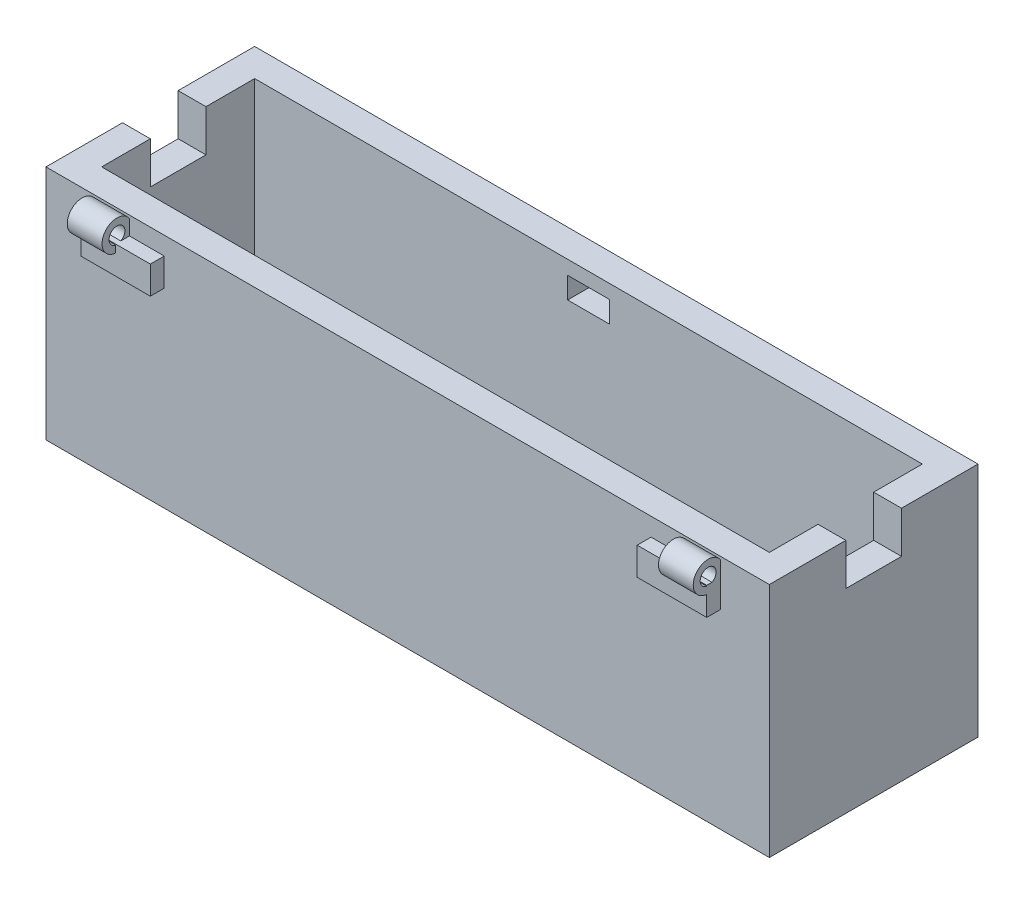
ISO-10303-21;
HEADER;
FILE_DESCRIPTION(('STEP AP214'),'2;1');
FILE_NAME('part.step','',(''),(''),'','','');
FILE_SCHEMA(('AUTOMOTIVE_DESIGN { 1 0 10303 214 1 1 1 1 }'));
ENDSEC;
DATA;
#1=APPLICATION_CONTEXT('core data for automotive mechanical design processes');
#2=APPLICATION_PROTOCOL_DEFINITION('international standard','automotive_design',2000,#1);
#3=PRODUCT_CONTEXT('',#1,'mechanical');
#4=PRODUCT('Part','Part','',(#3));
#5=PRODUCT_RELATED_PRODUCT_CATEGORY('part','',(#4));
#6=PRODUCT_DEFINITION_FORMATION('','',#4);
#7=PRODUCT_DEFINITION_CONTEXT('part definition',#1,'design');
#8=PRODUCT_DEFINITION('design','',#6,#7);
#9=PRODUCT_DEFINITION_SHAPE('','',#8);
#10=(LENGTH_UNIT() NAMED_UNIT(*) SI_UNIT(.MILLI.,.METRE.));
#11=(NAMED_UNIT(*) PLANE_ANGLE_UNIT() SI_UNIT($,.RADIAN.));
#12=(NAMED_UNIT(*) SI_UNIT($,.STERADIAN.) SOLID_ANGLE_UNIT());
#13=UNCERTAINTY_MEASURE_WITH_UNIT(LENGTH_MEASURE(1.E-05),#10,'distance_accuracy_value','');
#14=(GEOMETRIC_REPRESENTATION_CONTEXT(3) GLOBAL_UNCERTAINTY_ASSIGNED_CONTEXT((#13)) GLOBAL_UNIT_ASSIGNED_CONTEXT((#10,
#11,#12)) REPRESENTATION_CONTEXT('',''));
#15=CARTESIAN_POINT('',(0.,0.,0.));
#16=DIRECTION('',(0.,0.,1.));
#17=DIRECTION('',(1.,0.,0.));
#18=AXIS2_PLACEMENT_3D('',#15,#16,#17);
#19=CARTESIAN_POINT('',(-260.,140.,75.));
#20=DIRECTION('',(0.,0.,-1.));
#21=DIRECTION('',(-1.,0.,0.));
#22=AXIS2_PLACEMENT_3D('',#19,#20,#21);
#23=PLANE('',#22);
#24=DIRECTION('',(0.,-1.,0.));
#25=VECTOR('',#24,1.);
#26=CARTESIAN_POINT('',(200.,140.,75.));
#27=LINE('',#26,#25);
#28=CARTESIAN_POINT('',(200.,137.829772243199,75.));
#29=VERTEX_POINT('',#28);
#30=CARTESIAN_POINT('',(200.,127.,75.));
#31=VERTEX_POINT('',#30);
#32=EDGE_CURVE('E324',#29,#31,#27,.T.);
#33=ORIENTED_EDGE('',*,*,#32,.F.);
#34=DIRECTION('',(1.,0.,0.));
#35=VECTOR('',#34,1.);
#36=CARTESIAN_POINT('',(200.,137.829772243199,75.));
#37=LINE('',#36,#35);
#38=CARTESIAN_POINT('',(225.,137.829772243199,75.));
#39=VERTEX_POINT('',#38);
#40=EDGE_CURVE('E326',#29,#39,#37,.T.);
#41=ORIENTED_EDGE('',*,*,#40,.T.);
#42=DIRECTION('',(0.,-1.,0.));
#43=VECTOR('',#42,1.);
#44=CARTESIAN_POINT('',(225.,140.,75.));
#45=LINE('',#44,#43);
#46=CARTESIAN_POINT('',(225.,107.,75.));
#47=VERTEX_POINT('',#46);
#48=EDGE_CURVE('E542',#39,#47,#45,.T.);
#49=ORIENTED_EDGE('',*,*,#48,.T.);
#50=DIRECTION('',(-1.,0.,0.));
#51=VECTOR('',#50,1.);
#52=CARTESIAN_POINT('',(-260.,107.,75.));
#53=LINE('',#52,#51);
#54=CARTESIAN_POINT('',(175.,107.,75.));
#55=VERTEX_POINT('',#54);
#56=EDGE_CURVE('E539',#47,#55,#53,.T.);
#57=ORIENTED_EDGE('',*,*,#56,.T.);
#58=DIRECTION('',(0.,1.,0.));
#59=VECTOR('',#58,1.);
#60=CARTESIAN_POINT('',(175.,140.000000000001,75.));
#61=LINE('',#60,#59);
#62=CARTESIAN_POINT('',(175.,127.,75.));
#63=VERTEX_POINT('',#62);
#64=EDGE_CURVE('E547',#55,#63,#61,.T.);
#65=ORIENTED_EDGE('',*,*,#64,.T.);
#66=DIRECTION('',(1.,0.,0.));
#67=VECTOR('',#66,1.);
#68=CARTESIAN_POINT('',(-260.,127.,75.));
#69=LINE('',#68,#67);
#70=EDGE_CURVE('E544',#63,#31,#69,.T.);
#71=ORIENTED_EDGE('',*,*,#70,.T.);
#72=EDGE_LOOP('',(#33,#41,#49,#57,#65,#71));
#73=FACE_BOUND('',#72,.T.);
#74=DIRECTION('',(0.,-1.,0.));
#75=VECTOR('',#74,1.);
#76=CARTESIAN_POINT('',(-260.,140.,75.));
#77=LINE('',#76,#75);
#78=CARTESIAN_POINT('',(-260.,140.,75.));
#79=VERTEX_POINT('',#78);
#80=CARTESIAN_POINT('',(-260.,-30.,75.));
#81=VERTEX_POINT('',#80);
#82=EDGE_CURVE('E495',#79,#81,#77,.T.);
#83=ORIENTED_EDGE('',*,*,#82,.T.);
#84=DIRECTION('',(-1.,0.,0.));
#85=VECTOR('',#84,1.);
#86=CARTESIAN_POINT('',(-260.,-30.,75.));
#87=LINE('',#86,#85);
#88=CARTESIAN_POINT('',(260.,-30.,75.));
#89=VERTEX_POINT('',#88);
#90=EDGE_CURVE('E399',#89,#81,#87,.T.);
#91=ORIENTED_EDGE('',*,*,#90,.F.);
#92=DIRECTION('',(0.,-1.,0.));
#93=VECTOR('',#92,1.);
#94=CARTESIAN_POINT('',(260.,140.,75.));
#95=LINE('',#94,#93);
#96=CARTESIAN_POINT('',(260.,140.,75.));
#97=VERTEX_POINT('',#96);
#98=EDGE_CURVE('E493',#97,#89,#95,.T.);
#99=ORIENTED_EDGE('',*,*,#98,.F.);
#100=DIRECTION('',(1.,0.,0.));
#101=VECTOR('',#100,1.);
#102=CARTESIAN_POINT('',(-260.,140.,75.));
#103=LINE('',#102,#101);
#104=EDGE_CURVE('E491',#79,#97,#103,.T.);
#105=ORIENTED_EDGE('',*,*,#104,.F.);
#106=EDGE_LOOP('',(#83,#91,#99,#105));
#107=FACE_BOUND('',#106,.T.);
#108=DIRECTION('',(0.,1.,0.));
#109=VECTOR('',#108,1.);
#110=CARTESIAN_POINT('',(-200.,140.,75.));
#111=LINE('',#110,#109);
#112=CARTESIAN_POINT('',(-200.,127.,75.));
#113=VERTEX_POINT('',#112);
#114=CARTESIAN_POINT('',(-200.,137.829772243199,75.));
#115=VERTEX_POINT('',#114);
#116=EDGE_CURVE('E299',#113,#115,#111,.T.);
#117=ORIENTED_EDGE('',*,*,#116,.F.);
#118=DIRECTION('',(1.,0.,0.));
#119=VECTOR('',#118,1.);
#120=CARTESIAN_POINT('',(-260.,127.,75.));
#121=LINE('',#120,#119);
#122=CARTESIAN_POINT('',(-175.,127.,75.));
#123=VERTEX_POINT('',#122);
#124=EDGE_CURVE('E298',#113,#123,#121,.T.);
#125=ORIENTED_EDGE('',*,*,#124,.T.);
#126=DIRECTION('',(0.,-1.,0.));
#127=VECTOR('',#126,1.);
#128=CARTESIAN_POINT('',(-175.,140.,75.));
#129=LINE('',#128,#127);
#130=CARTESIAN_POINT('',(-175.,107.,75.));
#131=VERTEX_POINT('',#130);
#132=EDGE_CURVE('E533',#123,#131,#129,.T.);
#133=ORIENTED_EDGE('',*,*,#132,.T.);
#134=DIRECTION('',(-1.,0.,0.));
#135=VECTOR('',#134,1.);
#136=CARTESIAN_POINT('',(-260.,107.,75.));
#137=LINE('',#136,#135);
#138=CARTESIAN_POINT('',(-225.,107.,75.));
#139=VERTEX_POINT('',#138);
#140=EDGE_CURVE('E530',#131,#139,#137,.T.);
#141=ORIENTED_EDGE('',*,*,#140,.T.);
#142=DIRECTION('',(0.,1.,0.));
#143=VECTOR('',#142,1.);
#144=CARTESIAN_POINT('',(-225.,140.,75.));
#145=LINE('',#144,#143);
#146=CARTESIAN_POINT('',(-225.,137.829772243199,75.));
#147=VERTEX_POINT('',#146);
#148=EDGE_CURVE('E537',#139,#147,#145,.T.);
#149=ORIENTED_EDGE('',*,*,#148,.T.);
#150=DIRECTION('',(-1.,0.,0.));
#151=VECTOR('',#150,1.);
#152=CARTESIAN_POINT('',(-200.,137.829772243199,75.));
#153=LINE('',#152,#151);
#154=EDGE_CURVE('E301',#147,#115,#153,.F.);
#155=ORIENTED_EDGE('',*,*,#154,.T.);
#156=EDGE_LOOP('',(#117,#125,#133,#141,#149,#155));
#157=FACE_BOUND('',#156,.T.);
#158=ADVANCED_FACE('F45',(#73,#107,#157),#23,.F.);
#159=CARTESIAN_POINT('',(-225.,127.,65.));
#160=DIRECTION('',(0.,1.,0.));
#161=DIRECTION('',(0.,0.,1.));
#162=AXIS2_PLACEMENT_3D('',#159,#160,#161);
#163=PLANE('',#162);
#164=ORIENTED_EDGE('',*,*,#124,.F.);
#165=DIRECTION('',(0.,0.,1.));
#166=VECTOR('',#165,1.);
#167=CARTESIAN_POINT('',(-200.,127.,65.));
#168=LINE('',#167,#166);
#169=CARTESIAN_POINT('',(-200.,127.,81.2152908177372));
#170=VERTEX_POINT('',#169);
#171=EDGE_CURVE('E284',#113,#170,#168,.T.);
#172=ORIENTED_EDGE('',*,*,#171,.T.);
#173=DIRECTION('',(-1.,0.,0.));
#174=VECTOR('',#173,1.);
#175=CARTESIAN_POINT('',(-200.,127.,81.2152908177372));
#176=LINE('',#175,#174);
#177=CARTESIAN_POINT('',(-225.,127.,81.2152908177372));
#178=VERTEX_POINT('',#177);
#179=EDGE_CURVE('E279',#170,#178,#176,.T.);
#180=ORIENTED_EDGE('',*,*,#179,.T.);
#181=DIRECTION('',(0.,0.,1.));
#182=VECTOR('',#181,1.);
#183=CARTESIAN_POINT('',(-225.,127.,65.));
#184=LINE('',#183,#182);
#185=CARTESIAN_POINT('',(-225.,127.,85.));
#186=VERTEX_POINT('',#185);
#187=EDGE_CURVE('E364',#178,#186,#184,.T.);
#188=ORIENTED_EDGE('',*,*,#187,.T.);
#189=DIRECTION('',(-1.,0.,0.));
#190=VECTOR('',#189,1.);
#191=CARTESIAN_POINT('',(-225.,127.,85.));
#192=LINE('',#191,#190);
#193=CARTESIAN_POINT('',(-175.,127.,85.));
#194=VERTEX_POINT('',#193);
#195=EDGE_CURVE('E360',#194,#186,#192,.T.);
#196=ORIENTED_EDGE('',*,*,#195,.F.);
#197=DIRECTION('',(0.,0.,1.));
#198=VECTOR('',#197,1.);
#199=CARTESIAN_POINT('',(-175.,127.,65.));
#200=LINE('',#199,#198);
#201=EDGE_CURVE('E367',#123,#194,#200,.T.);
#202=ORIENTED_EDGE('',*,*,#201,.F.);
#203=EDGE_LOOP('',(#164,#172,#180,#188,#196,#202));
#204=FACE_BOUND('',#203,.T.);
#205=ADVANCED_FACE('F296',(#204),#163,.T.);
#206=CARTESIAN_POINT('',(175.,127.,65.));
#207=DIRECTION('',(0.,1.,0.));
#208=DIRECTION('',(0.,0.,1.));
#209=AXIS2_PLACEMENT_3D('',#206,#207,#208);
#210=PLANE('',#209);
#211=DIRECTION('',(1.,0.,0.));
#212=VECTOR('',#211,1.);
#213=CARTESIAN_POINT('',(200.,127.,81.2152908177372));
#214=LINE('',#213,#212);
#215=CARTESIAN_POINT('',(225.,127.,81.2152908177372));
#216=VERTEX_POINT('',#215);
#217=CARTESIAN_POINT('',(200.,127.,81.2152908177372));
#218=VERTEX_POINT('',#217);
#219=EDGE_CURVE('E316',#216,#218,#214,.F.);
#220=ORIENTED_EDGE('',*,*,#219,.T.);
#221=DIRECTION('',(0.,0.,-1.));
#222=VECTOR('',#221,1.);
#223=CARTESIAN_POINT('',(200.,127.,65.));
#224=LINE('',#223,#222);
#225=EDGE_CURVE('E321',#218,#31,#224,.T.);
#226=ORIENTED_EDGE('',*,*,#225,.T.);
#227=ORIENTED_EDGE('',*,*,#70,.F.);
#228=DIRECTION('',(0.,0.,1.));
#229=VECTOR('',#228,1.);
#230=CARTESIAN_POINT('',(175.,127.,65.));
#231=LINE('',#230,#229);
#232=CARTESIAN_POINT('',(175.,127.,85.));
#233=VERTEX_POINT('',#232);
#234=EDGE_CURVE('E343',#63,#233,#231,.T.);
#235=ORIENTED_EDGE('',*,*,#234,.T.);
#236=DIRECTION('',(-1.,0.,0.));
#237=VECTOR('',#236,1.);
#238=CARTESIAN_POINT('',(175.,127.,85.));
#239=LINE('',#238,#237);
#240=CARTESIAN_POINT('',(225.,127.,85.));
#241=VERTEX_POINT('',#240);
#242=EDGE_CURVE('E339',#241,#233,#239,.T.);
#243=ORIENTED_EDGE('',*,*,#242,.F.);
#244=DIRECTION('',(0.,0.,1.));
#245=VECTOR('',#244,1.);
#246=CARTESIAN_POINT('',(225.,127.,65.));
#247=LINE('',#246,#245);
#248=EDGE_CURVE('E346',#216,#241,#247,.T.);
#249=ORIENTED_EDGE('',*,*,#248,.F.);
#250=EDGE_LOOP('',(#220,#226,#227,#235,#243,#249));
#251=FACE_BOUND('',#250,.T.);
#252=ADVANCED_FACE('F600',(#251),#210,.T.);
#253=CARTESIAN_POINT('',(0.,140.,0.));
#254=DIRECTION('',(0.,1.,0.));
#255=DIRECTION('',(0.,0.,1.));
#256=AXIS2_PLACEMENT_3D('',#253,#254,#255);
#257=PLANE('',#256);
#258=DIRECTION('',(-1.,0.,0.));
#259=VECTOR('',#258,1.);
#260=CARTESIAN_POINT('',(260.,140.,-20.0000000000002));
#261=LINE('',#260,#259);
#262=CARTESIAN_POINT('',(260.,140.,-20.0000000000002));
#263=VERTEX_POINT('',#262);
#264=CARTESIAN_POINT('',(240.,140.,-20.0000000000002));
#265=VERTEX_POINT('',#264);
#266=EDGE_CURVE('E420',#263,#265,#261,.T.);
#267=ORIENTED_EDGE('',*,*,#266,.F.);
#268=DIRECTION('',(0.,0.,-1.));
#269=VECTOR('',#268,1.);
#270=CARTESIAN_POINT('',(260.,140.,-75.));
#271=LINE('',#270,#269);
#272=CARTESIAN_POINT('',(260.,140.,-75.));
#273=VERTEX_POINT('',#272);
#274=EDGE_CURVE('E471',#263,#273,#271,.T.);
#275=ORIENTED_EDGE('',*,*,#274,.T.);
#276=DIRECTION('',(-1.,0.,0.));
#277=VECTOR('',#276,1.);
#278=CARTESIAN_POINT('',(-260.,140.,-75.));
#279=LINE('',#278,#277);
#280=CARTESIAN_POINT('',(15.,140.,-75.));
#281=VERTEX_POINT('',#280);
#282=EDGE_CURVE('E483',#273,#281,#279,.T.);
#283=ORIENTED_EDGE('',*,*,#282,.T.);
#284=CARTESIAN_POINT('',(-15.0000000000001,140.,-75.));
#285=VERTEX_POINT('',#284);
#286=EDGE_CURVE('E487',#281,#285,#279,.T.);
#287=ORIENTED_EDGE('',*,*,#286,.T.);
#288=CARTESIAN_POINT('',(-260.,140.,-75.));
#289=VERTEX_POINT('',#288);
#290=EDGE_CURVE('E482',#285,#289,#279,.T.);
#291=ORIENTED_EDGE('',*,*,#290,.T.);
#292=DIRECTION('',(0.,0.,1.));
#293=VECTOR('',#292,1.);
#294=CARTESIAN_POINT('',(-260.,140.,-75.));
#295=LINE('',#294,#293);
#296=CARTESIAN_POINT('',(-260.,140.,-20.));
#297=VERTEX_POINT('',#296);
#298=EDGE_CURVE('E488',#289,#297,#295,.T.);
#299=ORIENTED_EDGE('',*,*,#298,.T.);
#300=CARTESIAN_POINT('',(-240.,140.,-20.));
#301=VERTEX_POINT('',#300);
#302=EDGE_CURVE('E423',#301,#297,#261,.T.);
#303=ORIENTED_EDGE('',*,*,#302,.F.);
#304=DIRECTION('',(0.,0.,1.));
#305=VECTOR('',#304,1.);
#306=CARTESIAN_POINT('',(-240.,140.,-55.));
#307=LINE('',#306,#305);
#308=CARTESIAN_POINT('',(-240.,140.,-55.));
#309=VERTEX_POINT('',#308);
#310=EDGE_CURVE('E464',#309,#301,#307,.T.);
#311=ORIENTED_EDGE('',*,*,#310,.F.);
#312=DIRECTION('',(-1.,0.,0.));
#313=VECTOR('',#312,1.);
#314=CARTESIAN_POINT('',(-240.,140.,-55.));
#315=LINE('',#314,#313);
#316=CARTESIAN_POINT('',(240.,140.,-55.));
#317=VERTEX_POINT('',#316);
#318=EDGE_CURVE('E460',#317,#309,#315,.T.);
#319=ORIENTED_EDGE('',*,*,#318,.F.);
#320=DIRECTION('',(0.,0.,-1.));
#321=VECTOR('',#320,1.);
#322=CARTESIAN_POINT('',(240.,140.,-55.));
#323=LINE('',#322,#321);
#324=EDGE_CURVE('E442',#265,#317,#323,.T.);
#325=ORIENTED_EDGE('',*,*,#324,.F.);
#326=EDGE_LOOP('',(#267,#275,#283,#287,#291,#299,#303,#311,#319,#325));
#327=FACE_BOUND('',#326,.T.);
#328=ADVANCED_FACE('F616',(#327),#257,.T.);
#329=CARTESIAN_POINT('',(260.,140.,-75.));
#330=DIRECTION('',(-1.,0.,0.));
#331=DIRECTION('',(0.,0.,1.));
#332=AXIS2_PLACEMENT_3D('',#329,#330,#331);
#333=PLANE('',#332);
#334=ORIENTED_EDGE('',*,*,#274,.F.);
#335=DIRECTION('',(0.,-1.,0.));
#336=VECTOR('',#335,1.);
#337=CARTESIAN_POINT('',(260.,140.,-20.0000000000002));
#338=LINE('',#337,#336);
#339=CARTESIAN_POINT('',(260.,110.,-20.0000000000002));
#340=VERTEX_POINT('',#339);
#341=EDGE_CURVE('E403',#263,#340,#338,.T.);
#342=ORIENTED_EDGE('',*,*,#341,.T.);
#343=DIRECTION('',(0.,0.,1.));
#344=VECTOR('',#343,1.);
#345=CARTESIAN_POINT('',(260.,110.,-20.0000000000002));
#346=LINE('',#345,#344);
#347=CARTESIAN_POINT('',(260.,110.,19.9999999999998));
#348=VERTEX_POINT('',#347);
#349=EDGE_CURVE('E406',#340,#348,#346,.T.);
#350=ORIENTED_EDGE('',*,*,#349,.T.);
#351=DIRECTION('',(0.,1.,0.));
#352=VECTOR('',#351,1.);
#353=CARTESIAN_POINT('',(260.,140.,19.9999999999998));
#354=LINE('',#353,#352);
#355=CARTESIAN_POINT('',(260.,140.,19.9999999999998));
#356=VERTEX_POINT('',#355);
#357=EDGE_CURVE('E410',#348,#356,#354,.T.);
#358=ORIENTED_EDGE('',*,*,#357,.T.);
#359=EDGE_CURVE('E479',#97,#356,#271,.T.);
#360=ORIENTED_EDGE('',*,*,#359,.F.);
#361=ORIENTED_EDGE('',*,*,#98,.T.);
#362=DIRECTION('',(0.,0.,1.));
#363=VECTOR('',#362,1.);
#364=CARTESIAN_POINT('',(260.,-30.,-75.));
#365=LINE('',#364,#363);
#366=CARTESIAN_POINT('',(260.,-30.,-75.));
#367=VERTEX_POINT('',#366);
#368=EDGE_CURVE('E396',#367,#89,#365,.T.);
#369=ORIENTED_EDGE('',*,*,#368,.F.);
#370=DIRECTION('',(0.,-1.,0.));
#371=VECTOR('',#370,1.);
#372=CARTESIAN_POINT('',(260.,140.,-75.));
#373=LINE('',#372,#371);
#374=EDGE_CURVE('E499',#273,#367,#373,.T.);
#375=ORIENTED_EDGE('',*,*,#374,.F.);
#376=EDGE_LOOP('',(#334,#342,#350,#358,#360,#361,#369,#375));
#377=FACE_BOUND('',#376,.T.);
#378=ADVANCED_FACE('F613',(#377),#333,.F.);
#379=CARTESIAN_POINT('',(-260.,140.,-75.));
#380=DIRECTION('',(0.,0.,1.));
#381=DIRECTION('',(1.,0.,0.));
#382=AXIS2_PLACEMENT_3D('',#379,#380,#381);
#383=PLANE('',#382);
#384=DIRECTION('',(0.,-1.,0.));
#385=VECTOR('',#384,1.);
#386=CARTESIAN_POINT('',(15.,130.,-75.));
#387=LINE('',#386,#385);
#388=CARTESIAN_POINT('',(15.,114.647041027345,-75.));
#389=VERTEX_POINT('',#388);
#390=EDGE_CURVE('E374',#281,#389,#387,.T.);
#391=ORIENTED_EDGE('',*,*,#390,.F.);
#392=ORIENTED_EDGE('',*,*,#282,.F.);
#393=ORIENTED_EDGE('',*,*,#374,.T.);
#394=DIRECTION('',(1.,0.,0.));
#395=VECTOR('',#394,1.);
#396=CARTESIAN_POINT('',(-260.,-30.,-75.));
#397=LINE('',#396,#395);
#398=CARTESIAN_POINT('',(-260.,-30.,-75.));
#399=VERTEX_POINT('',#398);
#400=EDGE_CURVE('E393',#399,#367,#397,.T.);
#401=ORIENTED_EDGE('',*,*,#400,.F.);
#402=DIRECTION('',(0.,-1.,0.));
#403=VECTOR('',#402,1.);
#404=CARTESIAN_POINT('',(-260.,140.,-75.));
#405=LINE('',#404,#403);
#406=EDGE_CURVE('E497',#289,#399,#405,.T.);
#407=ORIENTED_EDGE('',*,*,#406,.F.);
#408=ORIENTED_EDGE('',*,*,#290,.F.);
#409=DIRECTION('',(0.,1.,0.));
#410=VECTOR('',#409,1.);
#411=CARTESIAN_POINT('',(-15.0000000000001,130.,-75.));
#412=LINE('',#411,#410);
#413=CARTESIAN_POINT('',(-15.0000000000001,114.647041027345,-75.));
#414=VERTEX_POINT('',#413);
#415=EDGE_CURVE('E366',#414,#285,#412,.T.);
#416=ORIENTED_EDGE('',*,*,#415,.F.);
#417=DIRECTION('',(-1.,0.,0.));
#418=VECTOR('',#417,1.);
#419=CARTESIAN_POINT('',(15.,114.647041027345,-75.));
#420=LINE('',#419,#418);
#421=EDGE_CURVE('E377',#389,#414,#420,.T.);
#422=ORIENTED_EDGE('',*,*,#421,.F.);
#423=EDGE_LOOP('',(#391,#392,#393,#401,#407,#408,#416,#422));
#424=FACE_BOUND('',#423,.T.);
#425=ADVANCED_FACE('F610',(#424),#383,.F.);
#426=CARTESIAN_POINT('',(-260.,140.,-75.));
#427=DIRECTION('',(1.,0.,0.));
#428=DIRECTION('',(0.,0.,-1.));
#429=AXIS2_PLACEMENT_3D('',#426,#427,#428);
#430=PLANE('',#429);
#431=DIRECTION('',(0.,0.,1.));
#432=VECTOR('',#431,1.);
#433=CARTESIAN_POINT('',(-260.,110.,-20.));
#434=LINE('',#433,#432);
#435=CARTESIAN_POINT('',(-260.,110.,-20.));
#436=VERTEX_POINT('',#435);
#437=CARTESIAN_POINT('',(-260.,110.,20.));
#438=VERTEX_POINT('',#437);
#439=EDGE_CURVE('E416',#436,#438,#434,.T.);
#440=ORIENTED_EDGE('',*,*,#439,.F.);
#441=DIRECTION('',(0.,-1.,0.));
#442=VECTOR('',#441,1.);
#443=CARTESIAN_POINT('',(-260.,140.,-20.));
#444=LINE('',#443,#442);
#445=EDGE_CURVE('E402',#297,#436,#444,.T.);
#446=ORIENTED_EDGE('',*,*,#445,.F.);
#447=ORIENTED_EDGE('',*,*,#298,.F.);
#448=ORIENTED_EDGE('',*,*,#406,.T.);
#449=DIRECTION('',(0.,0.,-1.));
#450=VECTOR('',#449,1.);
#451=CARTESIAN_POINT('',(-260.,-30.,-75.));
#452=LINE('',#451,#450);
#453=EDGE_CURVE('E383',#81,#399,#452,.T.);
#454=ORIENTED_EDGE('',*,*,#453,.F.);
#455=ORIENTED_EDGE('',*,*,#82,.F.);
#456=CARTESIAN_POINT('',(-260.,140.,20.));
#457=VERTEX_POINT('',#456);
#458=EDGE_CURVE('E486',#457,#79,#295,.T.);
#459=ORIENTED_EDGE('',*,*,#458,.F.);
#460=DIRECTION('',(0.,1.,0.));
#461=VECTOR('',#460,1.);
#462=CARTESIAN_POINT('',(-260.,140.,20.));
#463=LINE('',#462,#461);
#464=EDGE_CURVE('E407',#438,#457,#463,.T.);
#465=ORIENTED_EDGE('',*,*,#464,.F.);
#466=EDGE_LOOP('',(#440,#446,#447,#448,#454,#455,#459,#465));
#467=FACE_BOUND('',#466,.T.);
#468=ADVANCED_FACE('F607',(#467),#430,.F.);
#469=DIRECTION('',(-1.,0.,0.));
#470=VECTOR('',#469,1.);
#471=CARTESIAN_POINT('',(260.,140.,19.9999999999998));
#472=LINE('',#471,#470);
#473=CARTESIAN_POINT('',(-240.,140.,20.));
#474=VERTEX_POINT('',#473);
#475=EDGE_CURVE('E427',#474,#457,#472,.T.);
#476=ORIENTED_EDGE('',*,*,#475,.T.);
#477=ORIENTED_EDGE('',*,*,#458,.T.);
#478=ORIENTED_EDGE('',*,*,#104,.T.);
#479=ORIENTED_EDGE('',*,*,#359,.T.);
#480=CARTESIAN_POINT('',(240.,140.,19.9999999999998));
#481=VERTEX_POINT('',#480);
#482=EDGE_CURVE('E424',#356,#481,#472,.T.);
#483=ORIENTED_EDGE('',*,*,#482,.T.);
#484=CARTESIAN_POINT('',(240.,140.,55.));
#485=VERTEX_POINT('',#484);
#486=EDGE_CURVE('E457',#485,#481,#323,.T.);
#487=ORIENTED_EDGE('',*,*,#486,.F.);
#488=DIRECTION('',(1.,0.,0.));
#489=VECTOR('',#488,1.);
#490=CARTESIAN_POINT('',(-240.,140.,55.));
#491=LINE('',#490,#489);
#492=CARTESIAN_POINT('',(-240.,140.,55.));
#493=VERTEX_POINT('',#492);
#494=EDGE_CURVE('E447',#493,#485,#491,.T.);
#495=ORIENTED_EDGE('',*,*,#494,.F.);
#496=EDGE_CURVE('E463',#474,#493,#307,.T.);
#497=ORIENTED_EDGE('',*,*,#496,.F.);
#498=EDGE_LOOP('',(#476,#477,#478,#479,#483,#487,#495,#497));
#499=FACE_BOUND('',#498,.T.);
#500=ADVANCED_FACE('F605',(#499),#257,.T.);
#501=CARTESIAN_POINT('',(240.,20.,-55.));
#502=DIRECTION('',(1.,0.,0.));
#503=DIRECTION('',(0.,0.,-1.));
#504=AXIS2_PLACEMENT_3D('',#501,#502,#503);
#505=PLANE('',#504);
#506=DIRECTION('',(0.,0.,-1.));
#507=VECTOR('',#506,1.);
#508=CARTESIAN_POINT('',(240.,110.,-55.));
#509=LINE('',#508,#507);
#510=CARTESIAN_POINT('',(240.,110.,19.9999999999998));
#511=VERTEX_POINT('',#510);
#512=CARTESIAN_POINT('',(240.,110.,-20.0000000000002));
#513=VERTEX_POINT('',#512);
#514=EDGE_CURVE('E422',#511,#513,#509,.T.);
#515=ORIENTED_EDGE('',*,*,#514,.T.);
#516=DIRECTION('',(0.,1.,0.));
#517=VECTOR('',#516,1.);
#518=CARTESIAN_POINT('',(240.,20.,-20.0000000000002));
#519=LINE('',#518,#517);
#520=EDGE_CURVE('E439',#513,#265,#519,.T.);
#521=ORIENTED_EDGE('',*,*,#520,.T.);
#522=ORIENTED_EDGE('',*,*,#324,.T.);
#523=DIRECTION('',(0.,1.,0.));
#524=VECTOR('',#523,1.);
#525=CARTESIAN_POINT('',(240.,20.,-55.));
#526=LINE('',#525,#524);
#527=CARTESIAN_POINT('',(240.,20.,-55.));
#528=VERTEX_POINT('',#527);
#529=EDGE_CURVE('E456',#528,#317,#526,.T.);
#530=ORIENTED_EDGE('',*,*,#529,.F.);
#531=DIRECTION('',(0.,0.,-1.));
#532=VECTOR('',#531,1.);
#533=CARTESIAN_POINT('',(240.,20.,-55.));
#534=LINE('',#533,#532);
#535=CARTESIAN_POINT('',(240.,20.,55.));
#536=VERTEX_POINT('',#535);
#537=EDGE_CURVE('E443',#536,#528,#534,.T.);
#538=ORIENTED_EDGE('',*,*,#537,.F.);
#539=DIRECTION('',(0.,1.,0.));
#540=VECTOR('',#539,1.);
#541=CARTESIAN_POINT('',(240.,20.,55.));
#542=LINE('',#541,#540);
#543=EDGE_CURVE('E469',#536,#485,#542,.T.);
#544=ORIENTED_EDGE('',*,*,#543,.T.);
#545=ORIENTED_EDGE('',*,*,#486,.T.);
#546=DIRECTION('',(0.,-1.,0.));
#547=VECTOR('',#546,1.);
#548=CARTESIAN_POINT('',(240.,20.,19.9999999999998));
#549=LINE('',#548,#547);
#550=EDGE_CURVE('E436',#481,#511,#549,.T.);
#551=ORIENTED_EDGE('',*,*,#550,.T.);
#552=EDGE_LOOP('',(#515,#521,#522,#530,#538,#544,#545,#551));
#553=FACE_BOUND('',#552,.T.);
#554=ADVANCED_FACE('F670',(#553),#505,.F.);
#555=CARTESIAN_POINT('',(-240.,20.,55.));
#556=DIRECTION('',(0.,0.,1.));
#557=DIRECTION('',(1.,0.,0.));
#558=AXIS2_PLACEMENT_3D('',#555,#556,#557);
#559=PLANE('',#558);
#560=ORIENTED_EDGE('',*,*,#494,.T.);
#561=ORIENTED_EDGE('',*,*,#543,.F.);
#562=DIRECTION('',(1.,0.,0.));
#563=VECTOR('',#562,1.);
#564=CARTESIAN_POINT('',(-240.,20.,55.));
#565=LINE('',#564,#563);
#566=CARTESIAN_POINT('',(-240.,20.,55.));
#567=VERTEX_POINT('',#566);
#568=EDGE_CURVE('E453',#567,#536,#565,.T.);
#569=ORIENTED_EDGE('',*,*,#568,.F.);
#570=DIRECTION('',(0.,1.,0.));
#571=VECTOR('',#570,1.);
#572=CARTESIAN_POINT('',(-240.,20.,55.));
#573=LINE('',#572,#571);
#574=EDGE_CURVE('E472',#567,#493,#573,.T.);
#575=ORIENTED_EDGE('',*,*,#574,.T.);
#576=EDGE_LOOP('',(#560,#561,#569,#575));
#577=FACE_BOUND('',#576,.T.);
#578=ADVANCED_FACE('F697',(#577),#559,.F.);
#579=CARTESIAN_POINT('',(-240.,20.,-55.));
#580=DIRECTION('',(-1.,0.,0.));
#581=DIRECTION('',(0.,0.,1.));
#582=AXIS2_PLACEMENT_3D('',#579,#580,#581);
#583=PLANE('',#582);
#584=ORIENTED_EDGE('',*,*,#310,.T.);
#585=DIRECTION('',(0.,-1.,0.));
#586=VECTOR('',#585,1.);
#587=CARTESIAN_POINT('',(-240.,20.,-20.));
#588=LINE('',#587,#586);
#589=CARTESIAN_POINT('',(-240.,110.,-20.));
#590=VERTEX_POINT('',#589);
#591=EDGE_CURVE('E507',#301,#590,#588,.T.);
#592=ORIENTED_EDGE('',*,*,#591,.T.);
#593=DIRECTION('',(0.,0.,1.));
#594=VECTOR('',#593,1.);
#595=CARTESIAN_POINT('',(-240.,110.,-55.));
#596=LINE('',#595,#594);
#597=CARTESIAN_POINT('',(-240.,110.,20.));
#598=VERTEX_POINT('',#597);
#599=EDGE_CURVE('E501',#590,#598,#596,.T.);
#600=ORIENTED_EDGE('',*,*,#599,.T.);
#601=DIRECTION('',(0.,1.,0.));
#602=VECTOR('',#601,1.);
#603=CARTESIAN_POINT('',(-240.,20.,20.));
#604=LINE('',#603,#602);
#605=EDGE_CURVE('E504',#598,#474,#604,.T.);
#606=ORIENTED_EDGE('',*,*,#605,.T.);
#607=ORIENTED_EDGE('',*,*,#496,.T.);
#608=ORIENTED_EDGE('',*,*,#574,.F.);
#609=DIRECTION('',(0.,0.,1.));
#610=VECTOR('',#609,1.);
#611=CARTESIAN_POINT('',(-240.,20.,-55.));
#612=LINE('',#611,#610);
#613=CARTESIAN_POINT('',(-240.,20.,-55.));
#614=VERTEX_POINT('',#613);
#615=EDGE_CURVE('E450',#614,#567,#612,.T.);
#616=ORIENTED_EDGE('',*,*,#615,.F.);
#617=DIRECTION('',(0.,1.,0.));
#618=VECTOR('',#617,1.);
#619=CARTESIAN_POINT('',(-240.,20.,-55.));
#620=LINE('',#619,#618);
#621=EDGE_CURVE('E475',#614,#309,#620,.T.);
#622=ORIENTED_EDGE('',*,*,#621,.T.);
#623=EDGE_LOOP('',(#584,#592,#600,#606,#607,#608,#616,#622));
#624=FACE_BOUND('',#623,.T.);
#625=ADVANCED_FACE('F664',(#624),#583,.F.);
#626=CARTESIAN_POINT('',(-240.,20.,-55.));
#627=DIRECTION('',(0.,0.,-1.));
#628=DIRECTION('',(-1.,0.,0.));
#629=AXIS2_PLACEMENT_3D('',#626,#627,#628);
#630=PLANE('',#629);
#631=DIRECTION('',(-1.,0.,0.));
#632=VECTOR('',#631,1.);
#633=CARTESIAN_POINT('',(-240.,114.647041027345,-55.));
#634=LINE('',#633,#632);
#635=CARTESIAN_POINT('',(15.,114.647041027345,-55.));
#636=VERTEX_POINT('',#635);
#637=CARTESIAN_POINT('',(-15.0000000000001,114.647041027345,-55.));
#638=VERTEX_POINT('',#637);
#639=EDGE_CURVE('E516',#636,#638,#634,.T.);
#640=ORIENTED_EDGE('',*,*,#639,.T.);
#641=DIRECTION('',(0.,1.,0.));
#642=VECTOR('',#641,1.);
#643=CARTESIAN_POINT('',(-15.0000000000001,20.,-55.));
#644=LINE('',#643,#642);
#645=CARTESIAN_POINT('',(-15.0000000000001,130.,-55.));
#646=VERTEX_POINT('',#645);
#647=EDGE_CURVE('E519',#638,#646,#644,.T.);
#648=ORIENTED_EDGE('',*,*,#647,.T.);
#649=DIRECTION('',(1.,0.,0.));
#650=VECTOR('',#649,1.);
#651=CARTESIAN_POINT('',(-240.,130.,-55.));
#652=LINE('',#651,#650);
#653=CARTESIAN_POINT('',(15.,130.,-55.));
#654=VERTEX_POINT('',#653);
#655=EDGE_CURVE('E510',#646,#654,#652,.T.);
#656=ORIENTED_EDGE('',*,*,#655,.T.);
#657=DIRECTION('',(0.,-1.,0.));
#658=VECTOR('',#657,1.);
#659=CARTESIAN_POINT('',(14.9999999999999,20.,-55.));
#660=LINE('',#659,#658);
#661=EDGE_CURVE('E513',#654,#636,#660,.T.);
#662=ORIENTED_EDGE('',*,*,#661,.T.);
#663=EDGE_LOOP('',(#640,#648,#656,#662));
#664=FACE_BOUND('',#663,.T.);
#665=ORIENTED_EDGE('',*,*,#318,.T.);
#666=ORIENTED_EDGE('',*,*,#621,.F.);
#667=DIRECTION('',(-1.,0.,0.));
#668=VECTOR('',#667,1.);
#669=CARTESIAN_POINT('',(-240.,20.,-55.));
#670=LINE('',#669,#668);
#671=EDGE_CURVE('E446',#528,#614,#670,.T.);
#672=ORIENTED_EDGE('',*,*,#671,.F.);
#673=ORIENTED_EDGE('',*,*,#529,.T.);
#674=EDGE_LOOP('',(#665,#666,#672,#673));
#675=FACE_BOUND('',#674,.T.);
#676=ADVANCED_FACE('F647',(#664,#675),#630,.F.);
#677=CARTESIAN_POINT('',(0.,20.,0.));
#678=DIRECTION('',(0.,1.,0.));
#679=DIRECTION('',(0.,0.,1.));
#680=AXIS2_PLACEMENT_3D('',#677,#678,#679);
#681=PLANE('',#680);
#682=ORIENTED_EDGE('',*,*,#537,.T.);
#683=ORIENTED_EDGE('',*,*,#671,.T.);
#684=ORIENTED_EDGE('',*,*,#615,.T.);
#685=ORIENTED_EDGE('',*,*,#568,.T.);
#686=EDGE_LOOP('',(#682,#683,#684,#685));
#687=FACE_BOUND('',#686,.T.);
#688=ADVANCED_FACE('F699',(#687),#681,.T.);
#689=CARTESIAN_POINT('',(260.,110.,-20.0000000000002));
#690=DIRECTION('',(0.,-1.,0.));
#691=DIRECTION('',(0.,0.,-1.));
#692=AXIS2_PLACEMENT_3D('',#689,#690,#691);
#693=PLANE('',#692);
#694=DIRECTION('',(-1.,0.,0.));
#695=VECTOR('',#694,1.);
#696=CARTESIAN_POINT('',(260.,110.,-20.0000000000002));
#697=LINE('',#696,#695);
#698=EDGE_CURVE('E413',#590,#436,#697,.T.);
#699=ORIENTED_EDGE('',*,*,#698,.T.);
#700=ORIENTED_EDGE('',*,*,#439,.T.);
#701=DIRECTION('',(-1.,0.,0.));
#702=VECTOR('',#701,1.);
#703=CARTESIAN_POINT('',(260.,110.,19.9999999999998));
#704=LINE('',#703,#702);
#705=EDGE_CURVE('E431',#598,#438,#704,.T.);
#706=ORIENTED_EDGE('',*,*,#705,.F.);
#707=ORIENTED_EDGE('',*,*,#599,.F.);
#708=EDGE_LOOP('',(#699,#700,#706,#707));
#709=FACE_BOUND('',#708,.T.);
#710=ADVANCED_FACE('F701',(#709),#693,.F.);
#711=CARTESIAN_POINT('',(260.,140.,19.9999999999998));
#712=DIRECTION('',(0.,0.,1.));
#713=DIRECTION('',(1.,0.,0.));
#714=AXIS2_PLACEMENT_3D('',#711,#712,#713);
#715=PLANE('',#714);
#716=ORIENTED_EDGE('',*,*,#705,.T.);
#717=ORIENTED_EDGE('',*,*,#464,.T.);
#718=ORIENTED_EDGE('',*,*,#475,.F.);
#719=ORIENTED_EDGE('',*,*,#605,.F.);
#720=EDGE_LOOP('',(#716,#717,#718,#719));
#721=FACE_BOUND('',#720,.T.);
#722=ADVANCED_FACE('F691',(#721),#715,.F.);
#723=CARTESIAN_POINT('',(260.,140.,-20.0000000000002));
#724=DIRECTION('',(0.,0.,-1.));
#725=DIRECTION('',(-1.,0.,0.));
#726=AXIS2_PLACEMENT_3D('',#723,#724,#725);
#727=PLANE('',#726);
#728=ORIENTED_EDGE('',*,*,#302,.T.);
#729=ORIENTED_EDGE('',*,*,#445,.T.);
#730=ORIENTED_EDGE('',*,*,#698,.F.);
#731=ORIENTED_EDGE('',*,*,#591,.F.);
#732=EDGE_LOOP('',(#728,#729,#730,#731));
#733=FACE_BOUND('',#732,.T.);
#734=ADVANCED_FACE('F662',(#733),#727,.F.);
#735=EDGE_CURVE('E432',#340,#513,#697,.T.);
#736=ORIENTED_EDGE('',*,*,#735,.F.);
#737=ORIENTED_EDGE('',*,*,#341,.F.);
#738=ORIENTED_EDGE('',*,*,#266,.T.);
#739=ORIENTED_EDGE('',*,*,#520,.F.);
#740=EDGE_LOOP('',(#736,#737,#738,#739));
#741=FACE_BOUND('',#740,.T.);
#742=ADVANCED_FACE('F673',(#741),#727,.F.);
#743=ORIENTED_EDGE('',*,*,#482,.F.);
#744=ORIENTED_EDGE('',*,*,#357,.F.);
#745=EDGE_CURVE('E428',#348,#511,#704,.T.);
#746=ORIENTED_EDGE('',*,*,#745,.T.);
#747=ORIENTED_EDGE('',*,*,#550,.F.);
#748=EDGE_LOOP('',(#743,#744,#746,#747));
#749=FACE_BOUND('',#748,.T.);
#750=ADVANCED_FACE('F942',(#749),#715,.F.);
#751=ORIENTED_EDGE('',*,*,#745,.F.);
#752=ORIENTED_EDGE('',*,*,#349,.F.);
#753=ORIENTED_EDGE('',*,*,#735,.T.);
#754=ORIENTED_EDGE('',*,*,#514,.F.);
#755=EDGE_LOOP('',(#751,#752,#753,#754));
#756=FACE_BOUND('',#755,.T.);
#757=ADVANCED_FACE('F676',(#756),#693,.F.);
#758=CARTESIAN_POINT('',(0.,-30.,0.));
#759=DIRECTION('',(0.,1.,0.));
#760=DIRECTION('',(0.,0.,1.));
#761=AXIS2_PLACEMENT_3D('',#758,#759,#760);
#762=PLANE('',#761);
#763=ORIENTED_EDGE('',*,*,#453,.T.);
#764=ORIENTED_EDGE('',*,*,#400,.T.);
#765=ORIENTED_EDGE('',*,*,#368,.T.);
#766=ORIENTED_EDGE('',*,*,#90,.T.);
#767=EDGE_LOOP('',(#763,#764,#765,#766));
#768=FACE_BOUND('',#767,.T.);
#769=ADVANCED_FACE('F689',(#768),#762,.F.);
#770=CARTESIAN_POINT('',(-15.0000000000001,130.,-45.));
#771=DIRECTION('',(-1.,0.,0.));
#772=DIRECTION('',(0.,-1.,0.));
#773=AXIS2_PLACEMENT_3D('',#770,#771,#772);
#774=PLANE('',#773);
#775=DIRECTION('',(0.,0.,-1.));
#776=VECTOR('',#775,1.);
#777=CARTESIAN_POINT('',(-15.0000000000001,114.647041027345,-45.));
#778=LINE('',#777,#776);
#779=EDGE_CURVE('E381',#638,#414,#778,.T.);
#780=ORIENTED_EDGE('',*,*,#779,.T.);
#781=ORIENTED_EDGE('',*,*,#415,.T.);
#782=CARTESIAN_POINT('',(-15.0000000000001,140.,-65.));
#783=DIRECTION('',(-1.,0.,0.));
#784=DIRECTION('',(0.,-1.,0.));
#785=AXIS2_PLACEMENT_3D('',#782,#783,#784);
#786=CIRCLE('',#785,10.);
#787=CARTESIAN_POINT('',(-15.0000000000001,130.,-65.));
#788=VERTEX_POINT('',#787);
#789=EDGE_CURVE('E528',#285,#788,#786,.T.);
#790=ORIENTED_EDGE('',*,*,#789,.T.);
#791=DIRECTION('',(0.,0.,-1.));
#792=VECTOR('',#791,1.);
#793=CARTESIAN_POINT('',(-15.0000000000001,130.,-45.));
#794=LINE('',#793,#792);
#795=EDGE_CURVE('E380',#646,#788,#794,.T.);
#796=ORIENTED_EDGE('',*,*,#795,.F.);
#797=ORIENTED_EDGE('',*,*,#647,.F.);
#798=EDGE_LOOP('',(#780,#781,#790,#796,#797));
#799=FACE_BOUND('',#798,.T.);
#800=ADVANCED_FACE('F644',(#799),#774,.F.);
#801=CARTESIAN_POINT('',(15.,114.647041027345,-45.));
#802=DIRECTION('',(0.,-1.,0.));
#803=DIRECTION('',(0.,0.,-1.));
#804=AXIS2_PLACEMENT_3D('',#801,#802,#803);
#805=PLANE('',#804);
#806=DIRECTION('',(0.,0.,-1.));
#807=VECTOR('',#806,1.);
#808=CARTESIAN_POINT('',(15.,114.647041027345,-45.));
#809=LINE('',#808,#807);
#810=EDGE_CURVE('E384',#636,#389,#809,.T.);
#811=ORIENTED_EDGE('',*,*,#810,.T.);
#812=ORIENTED_EDGE('',*,*,#421,.T.);
#813=ORIENTED_EDGE('',*,*,#779,.F.);
#814=ORIENTED_EDGE('',*,*,#639,.F.);
#815=EDGE_LOOP('',(#811,#812,#813,#814));
#816=FACE_BOUND('',#815,.T.);
#817=ADVANCED_FACE('F650',(#816),#805,.F.);
#818=CARTESIAN_POINT('',(15.,130.,-45.));
#819=DIRECTION('',(1.,0.,0.));
#820=DIRECTION('',(0.,0.,-1.));
#821=AXIS2_PLACEMENT_3D('',#818,#819,#820);
#822=PLANE('',#821);
#823=DIRECTION('',(0.,0.,-1.));
#824=VECTOR('',#823,1.);
#825=CARTESIAN_POINT('',(15.,130.,-45.));
#826=LINE('',#825,#824);
#827=CARTESIAN_POINT('',(15.,130.,-65.));
#828=VERTEX_POINT('',#827);
#829=EDGE_CURVE('E386',#654,#828,#826,.T.);
#830=ORIENTED_EDGE('',*,*,#829,.T.);
#831=CARTESIAN_POINT('',(15.,140.,-65.));
#832=DIRECTION('',(1.,0.,0.));
#833=DIRECTION('',(0.,0.,-1.));
#834=AXIS2_PLACEMENT_3D('',#831,#832,#833);
#835=CIRCLE('',#834,10.);
#836=EDGE_CURVE('E525',#828,#281,#835,.T.);
#837=ORIENTED_EDGE('',*,*,#836,.T.);
#838=ORIENTED_EDGE('',*,*,#390,.T.);
#839=ORIENTED_EDGE('',*,*,#810,.F.);
#840=ORIENTED_EDGE('',*,*,#661,.F.);
#841=EDGE_LOOP('',(#830,#837,#838,#839,#840));
#842=FACE_BOUND('',#841,.T.);
#843=ADVANCED_FACE('F635',(#842),#822,.F.);
#844=CARTESIAN_POINT('',(15.,130.,-45.));
#845=DIRECTION('',(0.,1.,0.));
#846=DIRECTION('',(0.,0.,1.));
#847=AXIS2_PLACEMENT_3D('',#844,#845,#846);
#848=PLANE('',#847);
#849=ORIENTED_EDGE('',*,*,#795,.T.);
#850=DIRECTION('',(1.,0.,0.));
#851=VECTOR('',#850,1.);
#852=CARTESIAN_POINT('',(15.,130.,-65.));
#853=LINE('',#852,#851);
#854=EDGE_CURVE('E522',#788,#828,#853,.T.);
#855=ORIENTED_EDGE('',*,*,#854,.T.);
#856=ORIENTED_EDGE('',*,*,#829,.F.);
#857=ORIENTED_EDGE('',*,*,#655,.F.);
#858=EDGE_LOOP('',(#849,#855,#856,#857));
#859=FACE_BOUND('',#858,.T.);
#860=ADVANCED_FACE('F641',(#859),#848,.F.);
#861=CARTESIAN_POINT('',(15.,140.,-65.));
#862=DIRECTION('',(1.,0.,0.));
#863=DIRECTION('',(0.,0.,-1.));
#864=AXIS2_PLACEMENT_3D('',#861,#862,#863);
#865=CYLINDRICAL_SURFACE('',#864,10.);
#866=ORIENTED_EDGE('',*,*,#789,.F.);
#867=ORIENTED_EDGE('',*,*,#286,.F.);
#868=ORIENTED_EDGE('',*,*,#836,.F.);
#869=ORIENTED_EDGE('',*,*,#854,.F.);
#870=EDGE_LOOP('',(#866,#867,#868,#869));
#871=FACE_BOUND('',#870,.T.);
#872=ADVANCED_FACE('F47',(#871),#865,.T.);
#873=CARTESIAN_POINT('',(-225.,127.,65.));
#874=DIRECTION('',(-1.,0.,0.));
#875=DIRECTION('',(0.,0.,1.));
#876=AXIS2_PLACEMENT_3D('',#873,#874,#875);
#877=PLANE('',#876);
#878=DIRECTION('',(0.,-1.,0.));
#879=VECTOR('',#878,1.);
#880=CARTESIAN_POINT('',(-225.,127.,85.));
#881=LINE('',#880,#879);
#882=CARTESIAN_POINT('',(-225.,121.323565932036,85.));
#883=VERTEX_POINT('',#882);
#884=CARTESIAN_POINT('',(-225.,107.,85.));
#885=VERTEX_POINT('',#884);
#886=EDGE_CURVE('E345',#883,#885,#881,.T.);
#887=ORIENTED_EDGE('',*,*,#886,.F.);
#888=CARTESIAN_POINT('',(-225.,132.,84.));
#889=DIRECTION('',(-1.,0.,0.));
#890=DIRECTION('',(0.,0.,1.));
#891=AXIS2_PLACEMENT_3D('',#888,#889,#890);
#892=CIRCLE('',#891,10.72316391778);
#893=EDGE_CURVE('E293',#883,#147,#892,.T.);
#894=ORIENTED_EDGE('',*,*,#893,.T.);
#895=ORIENTED_EDGE('',*,*,#148,.F.);
#896=DIRECTION('',(0.,0.,1.));
#897=VECTOR('',#896,1.);
#898=CARTESIAN_POINT('',(-225.,107.,65.));
#899=LINE('',#898,#897);
#900=EDGE_CURVE('E363',#139,#885,#899,.T.);
#901=ORIENTED_EDGE('',*,*,#900,.T.);
#902=EDGE_LOOP('',(#887,#894,#895,#901));
#903=FACE_BOUND('',#902,.T.);
#904=ORIENTED_EDGE('',*,*,#187,.F.);
#905=CARTESIAN_POINT('',(-225.,132.,84.));
#906=DIRECTION('',(-1.,0.,0.));
#907=DIRECTION('',(0.,0.,1.));
#908=AXIS2_PLACEMENT_3D('',#905,#906,#907);
#909=CIRCLE('',#908,5.72316391777998);
#910=CARTESIAN_POINT('',(-225.,126.364877531963,85.));
#911=VERTEX_POINT('',#910);
#912=EDGE_CURVE('E60',#911,#178,#909,.T.);
#913=ORIENTED_EDGE('',*,*,#912,.F.);
#914=EDGE_CURVE('E351',#186,#911,#881,.T.);
#915=ORIENTED_EDGE('',*,*,#914,.F.);
#916=EDGE_LOOP('',(#904,#913,#915));
#917=FACE_BOUND('',#916,.T.);
#918=ADVANCED_FACE('F565',(#903,#917),#877,.T.);
#919=CARTESIAN_POINT('',(-175.,127.,65.));
#920=DIRECTION('',(1.,0.,0.));
#921=DIRECTION('',(0.,0.,-1.));
#922=AXIS2_PLACEMENT_3D('',#919,#920,#921);
#923=PLANE('',#922);
#924=ORIENTED_EDGE('',*,*,#132,.F.);
#925=ORIENTED_EDGE('',*,*,#201,.T.);
#926=DIRECTION('',(0.,1.,0.));
#927=VECTOR('',#926,1.);
#928=CARTESIAN_POINT('',(-175.,127.,85.));
#929=LINE('',#928,#927);
#930=CARTESIAN_POINT('',(-175.,107.,85.));
#931=VERTEX_POINT('',#930);
#932=EDGE_CURVE('E357',#931,#194,#929,.T.);
#933=ORIENTED_EDGE('',*,*,#932,.F.);
#934=DIRECTION('',(0.,0.,1.));
#935=VECTOR('',#934,1.);
#936=CARTESIAN_POINT('',(-175.,107.,65.));
#937=LINE('',#936,#935);
#938=EDGE_CURVE('E369',#131,#931,#937,.T.);
#939=ORIENTED_EDGE('',*,*,#938,.F.);
#940=EDGE_LOOP('',(#924,#925,#933,#939));
#941=FACE_BOUND('',#940,.T.);
#942=ADVANCED_FACE('F583',(#941),#923,.T.);
#943=CARTESIAN_POINT('',(-225.,107.,65.));
#944=DIRECTION('',(0.,-1.,0.));
#945=DIRECTION('',(0.,0.,-1.));
#946=AXIS2_PLACEMENT_3D('',#943,#944,#945);
#947=PLANE('',#946);
#948=ORIENTED_EDGE('',*,*,#140,.F.);
#949=ORIENTED_EDGE('',*,*,#938,.T.);
#950=DIRECTION('',(1.,0.,0.));
#951=VECTOR('',#950,1.);
#952=CARTESIAN_POINT('',(-225.,107.,85.));
#953=LINE('',#952,#951);
#954=EDGE_CURVE('E354',#885,#931,#953,.T.);
#955=ORIENTED_EDGE('',*,*,#954,.F.);
#956=ORIENTED_EDGE('',*,*,#900,.F.);
#957=EDGE_LOOP('',(#948,#949,#955,#956));
#958=FACE_BOUND('',#957,.T.);
#959=ADVANCED_FACE('F579',(#958),#947,.T.);
#960=CARTESIAN_POINT('',(0.,0.,85.));
#961=DIRECTION('',(0.,0.,1.));
#962=DIRECTION('',(1.,0.,0.));
#963=AXIS2_PLACEMENT_3D('',#960,#961,#962);
#964=PLANE('',#963);
#965=DIRECTION('',(-1.,0.,0.));
#966=VECTOR('',#965,1.);
#967=CARTESIAN_POINT('',(-200.,121.323565932036,85.));
#968=LINE('',#967,#966);
#969=CARTESIAN_POINT('',(-200.,121.323565932036,85.));
#970=VERTEX_POINT('',#969);
#971=EDGE_CURVE('E12',#883,#970,#968,.F.);
#972=ORIENTED_EDGE('',*,*,#971,.F.);
#973=ORIENTED_EDGE('',*,*,#886,.T.);
#974=ORIENTED_EDGE('',*,*,#954,.T.);
#975=ORIENTED_EDGE('',*,*,#932,.T.);
#976=ORIENTED_EDGE('',*,*,#195,.T.);
#977=ORIENTED_EDGE('',*,*,#914,.T.);
#978=DIRECTION('',(-1.,0.,0.));
#979=VECTOR('',#978,1.);
#980=CARTESIAN_POINT('',(-200.,126.364877531963,85.));
#981=LINE('',#980,#979);
#982=CARTESIAN_POINT('',(-200.,126.364877531963,85.));
#983=VERTEX_POINT('',#982);
#984=EDGE_CURVE('E558',#911,#983,#981,.F.);
#985=ORIENTED_EDGE('',*,*,#984,.T.);
#986=DIRECTION('',(0.,-1.,0.));
#987=VECTOR('',#986,1.);
#988=CARTESIAN_POINT('',(-200.,0.,85.));
#989=LINE('',#988,#987);
#990=EDGE_CURVE('E53',#983,#970,#989,.T.);
#991=ORIENTED_EDGE('',*,*,#990,.T.);
#992=EDGE_LOOP('',(#972,#973,#974,#975,#976,#977,#985,#991));
#993=FACE_BOUND('',#992,.T.);
#994=ADVANCED_FACE('F561',(#993),#964,.T.);
#995=CARTESIAN_POINT('',(175.,127.,65.));
#996=DIRECTION('',(-1.,0.,0.));
#997=DIRECTION('',(0.,-1.,0.));
#998=AXIS2_PLACEMENT_3D('',#995,#996,#997);
#999=PLANE('',#998);
#1000=ORIENTED_EDGE('',*,*,#64,.F.);
#1001=DIRECTION('',(0.,0.,1.));
#1002=VECTOR('',#1001,1.);
#1003=CARTESIAN_POINT('',(175.,107.,65.));
#1004=LINE('',#1003,#1002);
#1005=CARTESIAN_POINT('',(175.,107.,85.));
#1006=VERTEX_POINT('',#1005);
#1007=EDGE_CURVE('E342',#55,#1006,#1004,.T.);
#1008=ORIENTED_EDGE('',*,*,#1007,.T.);
#1009=DIRECTION('',(0.,-1.,0.));
#1010=VECTOR('',#1009,1.);
#1011=CARTESIAN_POINT('',(175.,127.,85.));
#1012=LINE('',#1011,#1010);
#1013=EDGE_CURVE('E329',#233,#1006,#1012,.T.);
#1014=ORIENTED_EDGE('',*,*,#1013,.F.);
#1015=ORIENTED_EDGE('',*,*,#234,.F.);
#1016=EDGE_LOOP('',(#1000,#1008,#1014,#1015));
#1017=FACE_BOUND('',#1016,.T.);
#1018=ADVANCED_FACE('F789',(#1017),#999,.T.);
#1019=CARTESIAN_POINT('',(225.,127.,65.));
#1020=DIRECTION('',(1.,0.,0.));
#1021=DIRECTION('',(0.,0.,-1.));
#1022=AXIS2_PLACEMENT_3D('',#1019,#1020,#1021);
#1023=PLANE('',#1022);
#1024=CARTESIAN_POINT('',(225.,132.,84.));
#1025=DIRECTION('',(1.,0.,0.));
#1026=DIRECTION('',(0.,0.,-1.));
#1027=AXIS2_PLACEMENT_3D('',#1024,#1025,#1026);
#1028=CIRCLE('',#1027,5.72316391777998);
#1029=CARTESIAN_POINT('',(225.,126.364877531963,85.));
#1030=VERTEX_POINT('',#1029);
#1031=EDGE_CURVE('E307',#216,#1030,#1028,.T.);
#1032=ORIENTED_EDGE('',*,*,#1031,.F.);
#1033=ORIENTED_EDGE('',*,*,#248,.T.);
#1034=DIRECTION('',(0.,1.,0.));
#1035=VECTOR('',#1034,1.);
#1036=CARTESIAN_POINT('',(225.,127.,85.));
#1037=LINE('',#1036,#1035);
#1038=EDGE_CURVE('E335',#1030,#241,#1037,.T.);
#1039=ORIENTED_EDGE('',*,*,#1038,.F.);
#1040=EDGE_LOOP('',(#1032,#1033,#1039));
#1041=FACE_BOUND('',#1040,.T.);
#1042=DIRECTION('',(0.,0.,1.));
#1043=VECTOR('',#1042,1.);
#1044=CARTESIAN_POINT('',(225.,107.,65.));
#1045=LINE('',#1044,#1043);
#1046=CARTESIAN_POINT('',(225.,107.,85.));
#1047=VERTEX_POINT('',#1046);
#1048=EDGE_CURVE('E348',#47,#1047,#1045,.T.);
#1049=ORIENTED_EDGE('',*,*,#1048,.F.);
#1050=ORIENTED_EDGE('',*,*,#48,.F.);
#1051=CARTESIAN_POINT('',(225.,132.,84.));
#1052=DIRECTION('',(1.,0.,0.));
#1053=DIRECTION('',(0.,0.,-1.));
#1054=AXIS2_PLACEMENT_3D('',#1051,#1052,#1053);
#1055=CIRCLE('',#1054,10.72316391778);
#1056=CARTESIAN_POINT('',(225.,121.323565932036,85.));
#1057=VERTEX_POINT('',#1056);
#1058=EDGE_CURVE('E311',#39,#1057,#1055,.T.);
#1059=ORIENTED_EDGE('',*,*,#1058,.T.);
#1060=EDGE_CURVE('E336',#1047,#1057,#1037,.T.);
#1061=ORIENTED_EDGE('',*,*,#1060,.F.);
#1062=EDGE_LOOP('',(#1049,#1050,#1059,#1061));
#1063=FACE_BOUND('',#1062,.T.);
#1064=ADVANCED_FACE('F794',(#1041,#1063),#1023,.T.);
#1065=CARTESIAN_POINT('',(175.,107.,65.));
#1066=DIRECTION('',(0.,-1.,0.));
#1067=DIRECTION('',(0.,0.,-1.));
#1068=AXIS2_PLACEMENT_3D('',#1065,#1066,#1067);
#1069=PLANE('',#1068);
#1070=ORIENTED_EDGE('',*,*,#56,.F.);
#1071=ORIENTED_EDGE('',*,*,#1048,.T.);
#1072=DIRECTION('',(1.,0.,0.));
#1073=VECTOR('',#1072,1.);
#1074=CARTESIAN_POINT('',(175.,107.,85.));
#1075=LINE('',#1074,#1073);
#1076=EDGE_CURVE('E332',#1006,#1047,#1075,.T.);
#1077=ORIENTED_EDGE('',*,*,#1076,.F.);
#1078=ORIENTED_EDGE('',*,*,#1007,.F.);
#1079=EDGE_LOOP('',(#1070,#1071,#1077,#1078));
#1080=FACE_BOUND('',#1079,.T.);
#1081=ADVANCED_FACE('F802',(#1080),#1069,.T.);
#1082=CARTESIAN_POINT('',(0.,0.,85.));
#1083=DIRECTION('',(0.,0.,1.));
#1084=DIRECTION('',(1.,0.,0.));
#1085=AXIS2_PLACEMENT_3D('',#1082,#1083,#1084);
#1086=PLANE('',#1085);
#1087=DIRECTION('',(1.,0.,0.));
#1088=VECTOR('',#1087,1.);
#1089=CARTESIAN_POINT('',(200.,121.323565932036,85.));
#1090=LINE('',#1089,#1088);
#1091=CARTESIAN_POINT('',(200.,121.323565932036,85.));
#1092=VERTEX_POINT('',#1091);
#1093=EDGE_CURVE('E556',#1092,#1057,#1090,.T.);
#1094=ORIENTED_EDGE('',*,*,#1093,.F.);
#1095=DIRECTION('',(0.,1.,0.));
#1096=VECTOR('',#1095,1.);
#1097=CARTESIAN_POINT('',(200.,0.,85.));
#1098=LINE('',#1097,#1096);
#1099=CARTESIAN_POINT('',(200.,126.364877531963,85.));
#1100=VERTEX_POINT('',#1099);
#1101=EDGE_CURVE('E553',#1092,#1100,#1098,.T.);
#1102=ORIENTED_EDGE('',*,*,#1101,.T.);
#1103=DIRECTION('',(1.,0.,0.));
#1104=VECTOR('',#1103,1.);
#1105=CARTESIAN_POINT('',(200.,126.364877531963,85.));
#1106=LINE('',#1105,#1104);
#1107=EDGE_CURVE('E550',#1100,#1030,#1106,.T.);
#1108=ORIENTED_EDGE('',*,*,#1107,.T.);
#1109=ORIENTED_EDGE('',*,*,#1038,.T.);
#1110=ORIENTED_EDGE('',*,*,#242,.T.);
#1111=ORIENTED_EDGE('',*,*,#1013,.T.);
#1112=ORIENTED_EDGE('',*,*,#1076,.T.);
#1113=ORIENTED_EDGE('',*,*,#1060,.T.);
#1114=EDGE_LOOP('',(#1094,#1102,#1108,#1109,#1110,#1111,#1112,#1113));
#1115=FACE_BOUND('',#1114,.T.);
#1116=ADVANCED_FACE('F807',(#1115),#1086,.T.);
#1117=CARTESIAN_POINT('',(200.,132.,84.));
#1118=DIRECTION('',(1.,0.,0.));
#1119=DIRECTION('',(0.,0.,-1.));
#1120=AXIS2_PLACEMENT_3D('',#1117,#1118,#1119);
#1121=CYLINDRICAL_SURFACE('',#1120,10.72316391778);
#1122=ORIENTED_EDGE('',*,*,#40,.F.);
#1123=CARTESIAN_POINT('',(200.,132.,84.));
#1124=DIRECTION('',(1.,0.,0.));
#1125=DIRECTION('',(0.,0.,-1.));
#1126=AXIS2_PLACEMENT_3D('',#1123,#1124,#1125);
#1127=CIRCLE('',#1126,10.72316391778);
#1128=EDGE_CURVE('E313',#29,#1092,#1127,.T.);
#1129=ORIENTED_EDGE('',*,*,#1128,.T.);
#1130=ORIENTED_EDGE('',*,*,#1093,.T.);
#1131=ORIENTED_EDGE('',*,*,#1058,.F.);
#1132=EDGE_LOOP('',(#1122,#1129,#1130,#1131));
#1133=FACE_BOUND('',#1132,.T.);
#1134=ADVANCED_FACE('F835',(#1133),#1121,.T.);
#1135=CARTESIAN_POINT('',(200.,132.,84.));
#1136=DIRECTION('',(1.,0.,0.));
#1137=DIRECTION('',(0.,0.,-1.));
#1138=AXIS2_PLACEMENT_3D('',#1135,#1136,#1137);
#1139=PLANE('',#1138);
#1140=ORIENTED_EDGE('',*,*,#1128,.F.);
#1141=ORIENTED_EDGE('',*,*,#32,.T.);
#1142=ORIENTED_EDGE('',*,*,#225,.F.);
#1143=CARTESIAN_POINT('',(200.,132.,84.));
#1144=DIRECTION('',(1.,0.,0.));
#1145=DIRECTION('',(0.,0.,-1.));
#1146=AXIS2_PLACEMENT_3D('',#1143,#1144,#1145);
#1147=CIRCLE('',#1146,5.72316391777998);
#1148=EDGE_CURVE('E308',#218,#1100,#1147,.T.);
#1149=ORIENTED_EDGE('',*,*,#1148,.T.);
#1150=ORIENTED_EDGE('',*,*,#1101,.F.);
#1151=EDGE_LOOP('',(#1140,#1141,#1142,#1149,#1150));
#1152=FACE_BOUND('',#1151,.T.);
#1153=ADVANCED_FACE('F844',(#1152),#1139,.F.);
#1154=CARTESIAN_POINT('',(200.,132.,84.));
#1155=DIRECTION('',(1.,0.,0.));
#1156=DIRECTION('',(0.,0.,-1.));
#1157=AXIS2_PLACEMENT_3D('',#1154,#1155,#1156);
#1158=CYLINDRICAL_SURFACE('',#1157,5.72316391777998);
#1159=ORIENTED_EDGE('',*,*,#219,.F.);
#1160=ORIENTED_EDGE('',*,*,#1031,.T.);
#1161=ORIENTED_EDGE('',*,*,#1107,.F.);
#1162=ORIENTED_EDGE('',*,*,#1148,.F.);
#1163=EDGE_LOOP('',(#1159,#1160,#1161,#1162));
#1164=FACE_BOUND('',#1163,.T.);
#1165=ADVANCED_FACE('F854',(#1164),#1158,.F.);
#1166=CARTESIAN_POINT('',(-200.,132.,84.));
#1167=DIRECTION('',(-1.,0.,0.));
#1168=DIRECTION('',(0.,0.,1.));
#1169=AXIS2_PLACEMENT_3D('',#1166,#1167,#1168);
#1170=CYLINDRICAL_SURFACE('',#1169,10.72316391778);
#1171=ORIENTED_EDGE('',*,*,#154,.F.);
#1172=ORIENTED_EDGE('',*,*,#893,.F.);
#1173=ORIENTED_EDGE('',*,*,#971,.T.);
#1174=CARTESIAN_POINT('',(-200.,132.,84.));
#1175=DIRECTION('',(-1.,0.,0.));
#1176=DIRECTION('',(0.,0.,1.));
#1177=AXIS2_PLACEMENT_3D('',#1174,#1175,#1176);
#1178=CIRCLE('',#1177,10.72316391778);
#1179=EDGE_CURVE('E285',#970,#115,#1178,.T.);
#1180=ORIENTED_EDGE('',*,*,#1179,.T.);
#1181=EDGE_LOOP('',(#1171,#1172,#1173,#1180));
#1182=FACE_BOUND('',#1181,.T.);
#1183=ADVANCED_FACE('F574',(#1182),#1170,.T.);
#1184=CARTESIAN_POINT('',(-200.,132.,84.));
#1185=DIRECTION('',(-1.,0.,0.));
#1186=DIRECTION('',(0.,0.,1.));
#1187=AXIS2_PLACEMENT_3D('',#1184,#1185,#1186);
#1188=PLANE('',#1187);
#1189=ORIENTED_EDGE('',*,*,#171,.F.);
#1190=ORIENTED_EDGE('',*,*,#116,.T.);
#1191=ORIENTED_EDGE('',*,*,#1179,.F.);
#1192=ORIENTED_EDGE('',*,*,#990,.F.);
#1193=CARTESIAN_POINT('',(-200.,132.,84.));
#1194=DIRECTION('',(-1.,0.,0.));
#1195=DIRECTION('',(0.,0.,1.));
#1196=AXIS2_PLACEMENT_3D('',#1193,#1194,#1195);
#1197=CIRCLE('',#1196,5.72316391777998);
#1198=EDGE_CURVE('E65',#983,#170,#1197,.T.);
#1199=ORIENTED_EDGE('',*,*,#1198,.T.);
#1200=EDGE_LOOP('',(#1189,#1190,#1191,#1192,#1199));
#1201=FACE_BOUND('',#1200,.T.);
#1202=ADVANCED_FACE('F288',(#1201),#1188,.F.);
#1203=CARTESIAN_POINT('',(-200.,132.,84.));
#1204=DIRECTION('',(-1.,0.,0.));
#1205=DIRECTION('',(0.,0.,1.));
#1206=AXIS2_PLACEMENT_3D('',#1203,#1204,#1205);
#1207=CYLINDRICAL_SURFACE('',#1206,5.72316391777998);
#1208=ORIENTED_EDGE('',*,*,#179,.F.);
#1209=ORIENTED_EDGE('',*,*,#1198,.F.);
#1210=ORIENTED_EDGE('',*,*,#984,.F.);
#1211=ORIENTED_EDGE('',*,*,#912,.T.);
#1212=EDGE_LOOP('',(#1208,#1209,#1210,#1211));
#1213=FACE_BOUND('',#1212,.T.);
#1214=ADVANCED_FACE('F280',(#1213),#1207,.F.);
#1215=CLOSED_SHELL('',(#158,#205,#252,#328,#378,#425,#468,#500,#554,#578,#625,#676,#688,#710,
#722,#734,#742,#750,#757,#769,#800,#817,#843,#860,#872,#918,#942,#959,#994,#1018,#1064,#1081,
#1116,#1134,#1153,#1165,#1183,#1202,#1214));
#1216=MANIFOLD_SOLID_BREP('B2',#1215);
#1217=ADVANCED_BREP_SHAPE_REPRESENTATION('',(#18,#1216),#14);
#1218=SHAPE_DEFINITION_REPRESENTATION(#9,#1217);
ENDSEC;
END-ISO-10303-21;
